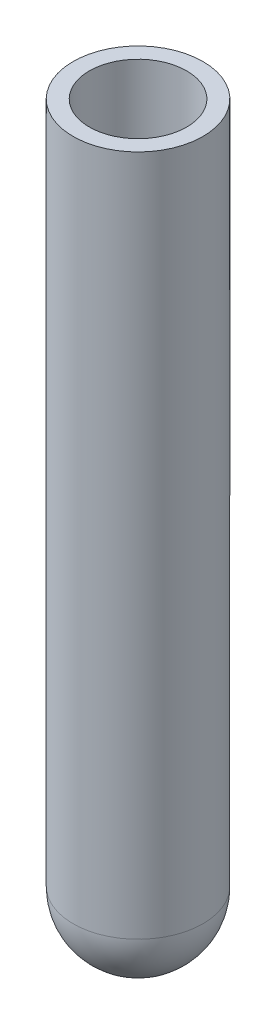
ISO-10303-21;
HEADER;
FILE_DESCRIPTION(('STEP AP214'),'2;1');
FILE_NAME('part.step','',(''),(''),'','','');
FILE_SCHEMA(('AUTOMOTIVE_DESIGN { 1 0 10303 214 1 1 1 1 }'));
ENDSEC;
DATA;
#1=APPLICATION_CONTEXT('core data for automotive mechanical design processes');
#2=APPLICATION_PROTOCOL_DEFINITION('international standard','automotive_design',2000,#1);
#3=PRODUCT_CONTEXT('',#1,'mechanical');
#4=PRODUCT('Part','Part','',(#3));
#5=PRODUCT_RELATED_PRODUCT_CATEGORY('part','',(#4));
#6=PRODUCT_DEFINITION_FORMATION('','',#4);
#7=PRODUCT_DEFINITION_CONTEXT('part definition',#1,'design');
#8=PRODUCT_DEFINITION('design','',#6,#7);
#9=PRODUCT_DEFINITION_SHAPE('','',#8);
#10=(LENGTH_UNIT() NAMED_UNIT(*) SI_UNIT(.MILLI.,.METRE.));
#11=(NAMED_UNIT(*) PLANE_ANGLE_UNIT() SI_UNIT($,.RADIAN.));
#12=(NAMED_UNIT(*) SI_UNIT($,.STERADIAN.) SOLID_ANGLE_UNIT());
#13=UNCERTAINTY_MEASURE_WITH_UNIT(LENGTH_MEASURE(1.E-05),#10,'distance_accuracy_value','');
#14=(GEOMETRIC_REPRESENTATION_CONTEXT(3) GLOBAL_UNCERTAINTY_ASSIGNED_CONTEXT((#13)) GLOBAL_UNIT_ASSIGNED_CONTEXT((#10,
#11,#12)) REPRESENTATION_CONTEXT('',''));
#15=CARTESIAN_POINT('',(0.,0.,0.));
#16=DIRECTION('',(0.,0.,1.));
#17=DIRECTION('',(1.,0.,0.));
#18=AXIS2_PLACEMENT_3D('',#15,#16,#17);
#19=CARTESIAN_POINT('',(0.,-34.,0.));
#20=DIRECTION('',(0.,-1.,0.));
#21=DIRECTION('',(1.,0.,0.));
#22=AXIS2_PLACEMENT_3D('',#19,#20,#21);
#23=SPHERICAL_SURFACE('',#22,7.99999999999999);
#24=CARTESIAN_POINT('',(0.,-34.,0.));
#25=DIRECTION('',(0.,-1.,0.));
#26=DIRECTION('',(0.,0.,-1.));
#27=AXIS2_PLACEMENT_3D('',#24,#25,#26);
#28=CIRCLE('',#27,8.);
#29=CARTESIAN_POINT('',(0.,-34.,-8.));
#30=VERTEX_POINT('',#29);
#31=EDGE_CURVE('E10',#30,#30,#28,.T.);
#32=ORIENTED_EDGE('',*,*,#31,.T.);
#33=EDGE_LOOP('',(#32));
#34=FACE_BOUND('',#33,.T.);
#35=ADVANCED_FACE('F30',(#34),#23,.T.);
#36=CARTESIAN_POINT('',(0.,0.,0.));
#37=DIRECTION('',(0.,-1.,0.));
#38=DIRECTION('',(0.,0.,-1.));
#39=AXIS2_PLACEMENT_3D('',#36,#37,#38);
#40=CYLINDRICAL_SURFACE('',#39,8.);
#41=CARTESIAN_POINT('',(0.,50.,0.));
#42=DIRECTION('',(0.,-1.,0.));
#43=DIRECTION('',(0.,0.,-1.));
#44=AXIS2_PLACEMENT_3D('',#41,#42,#43);
#45=CIRCLE('',#44,8.);
#46=CARTESIAN_POINT('',(0.,50.,-8.));
#47=VERTEX_POINT('',#46);
#48=EDGE_CURVE('E36',#47,#47,#45,.T.);
#49=ORIENTED_EDGE('',*,*,#48,.T.);
#50=EDGE_LOOP('',(#49));
#51=FACE_BOUND('',#50,.T.);
#52=ORIENTED_EDGE('',*,*,#31,.F.);
#53=EDGE_LOOP('',(#52));
#54=FACE_BOUND('',#53,.T.);
#55=ADVANCED_FACE('F62',(#51,#54),#40,.T.);
#56=CARTESIAN_POINT('',(8.,50.,0.));
#57=DIRECTION('',(0.,1.,0.));
#58=DIRECTION('',(0.,0.,1.));
#59=AXIS2_PLACEMENT_3D('',#56,#57,#58);
#60=PLANE('',#59);
#61=CARTESIAN_POINT('',(0.,50.,0.));
#62=DIRECTION('',(0.,-1.,0.));
#63=DIRECTION('',(0.,0.,-1.));
#64=AXIS2_PLACEMENT_3D('',#61,#62,#63);
#65=CIRCLE('',#64,5.99999999999999);
#66=CARTESIAN_POINT('',(0.,50.,-5.99999999999999));
#67=VERTEX_POINT('',#66);
#68=EDGE_CURVE('E40',#67,#67,#65,.T.);
#69=ORIENTED_EDGE('',*,*,#68,.T.);
#70=EDGE_LOOP('',(#69));
#71=FACE_BOUND('',#70,.T.);
#72=ORIENTED_EDGE('',*,*,#48,.F.);
#73=EDGE_LOOP('',(#72));
#74=FACE_BOUND('',#73,.T.);
#75=ADVANCED_FACE('F59',(#71,#74),#60,.T.);
#76=CARTESIAN_POINT('',(0.,0.,0.));
#77=DIRECTION('',(0.,-1.,0.));
#78=DIRECTION('',(0.,0.,-1.));
#79=AXIS2_PLACEMENT_3D('',#76,#77,#78);
#80=CYLINDRICAL_SURFACE('',#79,5.99999999999999);
#81=CARTESIAN_POINT('',(0.,-34.,0.));
#82=DIRECTION('',(0.,-1.,0.));
#83=DIRECTION('',(0.,0.,-1.));
#84=AXIS2_PLACEMENT_3D('',#81,#82,#83);
#85=CIRCLE('',#84,6.);
#86=CARTESIAN_POINT('',(0.,-34.,-6.));
#87=VERTEX_POINT('',#86);
#88=EDGE_CURVE('E44',#87,#87,#85,.T.);
#89=ORIENTED_EDGE('',*,*,#88,.T.);
#90=EDGE_LOOP('',(#89));
#91=FACE_BOUND('',#90,.T.);
#92=ORIENTED_EDGE('',*,*,#68,.F.);
#93=EDGE_LOOP('',(#92));
#94=FACE_BOUND('',#93,.T.);
#95=ADVANCED_FACE('F50',(#91,#94),#80,.F.);
#96=CARTESIAN_POINT('',(0.,-34.,0.));
#97=DIRECTION('',(0.,-1.,0.));
#98=DIRECTION('',(1.,0.,0.));
#99=AXIS2_PLACEMENT_3D('',#96,#97,#98);
#100=SPHERICAL_SURFACE('',#99,5.99999999999999);
#101=ORIENTED_EDGE('',*,*,#88,.F.);
#102=EDGE_LOOP('',(#101));
#103=FACE_BOUND('',#102,.T.);
#104=ADVANCED_FACE('F53',(#103),#100,.F.);
#105=CLOSED_SHELL('',(#35,#55,#75,#95,#104));
#106=MANIFOLD_SOLID_BREP('B2',#105);
#107=ADVANCED_BREP_SHAPE_REPRESENTATION('',(#18,#106),#14);
#108=SHAPE_DEFINITION_REPRESENTATION(#9,#107);
ENDSEC;
END-ISO-10303-21;
